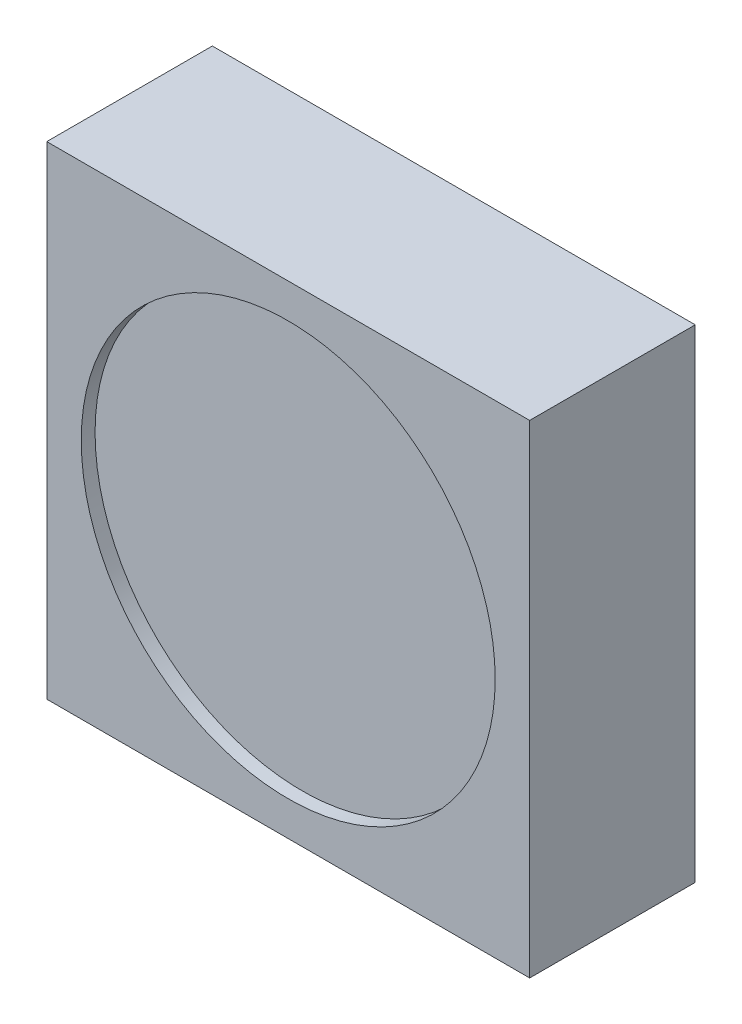
ISO-10303-21;
HEADER;
FILE_DESCRIPTION(('STEP AP214'),'2;1');
FILE_NAME('part.step','',(''),(''),'','','');
FILE_SCHEMA(('AUTOMOTIVE_DESIGN { 1 0 10303 214 1 1 1 1 }'));
ENDSEC;
DATA;
#1=APPLICATION_CONTEXT('core data for automotive mechanical design processes');
#2=APPLICATION_PROTOCOL_DEFINITION('international standard','automotive_design',2000,#1);
#3=PRODUCT_CONTEXT('',#1,'mechanical');
#4=PRODUCT('Part','Part','',(#3));
#5=PRODUCT_RELATED_PRODUCT_CATEGORY('part','',(#4));
#6=PRODUCT_DEFINITION_FORMATION('','',#4);
#7=PRODUCT_DEFINITION_CONTEXT('part definition',#1,'design');
#8=PRODUCT_DEFINITION('design','',#6,#7);
#9=PRODUCT_DEFINITION_SHAPE('','',#8);
#10=(LENGTH_UNIT() NAMED_UNIT(*) SI_UNIT(.MILLI.,.METRE.));
#11=(NAMED_UNIT(*) PLANE_ANGLE_UNIT() SI_UNIT($,.RADIAN.));
#12=(NAMED_UNIT(*) SI_UNIT($,.STERADIAN.) SOLID_ANGLE_UNIT());
#13=UNCERTAINTY_MEASURE_WITH_UNIT(LENGTH_MEASURE(1.E-05),#10,'distance_accuracy_value','');
#14=(GEOMETRIC_REPRESENTATION_CONTEXT(3) GLOBAL_UNCERTAINTY_ASSIGNED_CONTEXT((#13)) GLOBAL_UNIT_ASSIGNED_CONTEXT((#10,
#11,#12)) REPRESENTATION_CONTEXT('',''));
#15=CARTESIAN_POINT('',(0.,0.,0.));
#16=DIRECTION('',(0.,0.,1.));
#17=DIRECTION('',(1.,0.,0.));
#18=AXIS2_PLACEMENT_3D('',#15,#16,#17);
#19=CARTESIAN_POINT('',(0.,0.,0.));
#20=DIRECTION('',(0.,0.,1.));
#21=DIRECTION('',(1.,0.,0.));
#22=AXIS2_PLACEMENT_3D('',#19,#20,#21);
#23=PLANE('',#22);
#24=DIRECTION('',(0.,1.,0.));
#25=VECTOR('',#24,1.);
#26=CARTESIAN_POINT('',(1.75,-1.75,0.));
#27=LINE('',#26,#25);
#28=CARTESIAN_POINT('',(1.75,-1.75,0.));
#29=VERTEX_POINT('',#28);
#30=CARTESIAN_POINT('',(1.75,1.75,0.));
#31=VERTEX_POINT('',#30);
#32=EDGE_CURVE('E29',#29,#31,#27,.T.);
#33=ORIENTED_EDGE('',*,*,#32,.F.);
#34=DIRECTION('',(1.,0.,0.));
#35=VECTOR('',#34,1.);
#36=CARTESIAN_POINT('',(-1.75,-1.75,0.));
#37=LINE('',#36,#35);
#38=CARTESIAN_POINT('',(-1.75,-1.75,0.));
#39=VERTEX_POINT('',#38);
#40=EDGE_CURVE('E91',#39,#29,#37,.T.);
#41=ORIENTED_EDGE('',*,*,#40,.F.);
#42=DIRECTION('',(0.,-1.,0.));
#43=VECTOR('',#42,1.);
#44=CARTESIAN_POINT('',(-1.75,1.75,0.));
#45=LINE('',#44,#43);
#46=CARTESIAN_POINT('',(-1.75,1.75,0.));
#47=VERTEX_POINT('',#46);
#48=EDGE_CURVE('E100',#47,#39,#45,.T.);
#49=ORIENTED_EDGE('',*,*,#48,.F.);
#50=DIRECTION('',(-1.,0.,0.));
#51=VECTOR('',#50,1.);
#52=CARTESIAN_POINT('',(1.75,1.75,0.));
#53=LINE('',#52,#51);
#54=EDGE_CURVE('E109',#31,#47,#53,.T.);
#55=ORIENTED_EDGE('',*,*,#54,.F.);
#56=EDGE_LOOP('',(#33,#41,#49,#55));
#57=FACE_BOUND('',#56,.T.);
#58=ADVANCED_FACE('F18',(#57),#23,.F.);
#59=CARTESIAN_POINT('',(0.,0.,1.2));
#60=DIRECTION('',(0.,0.,1.));
#61=DIRECTION('',(1.,0.,0.));
#62=AXIS2_PLACEMENT_3D('',#59,#60,#61);
#63=PLANE('',#62);
#64=CARTESIAN_POINT('',(0.,0.,1.2));
#65=DIRECTION('',(0.,0.,-1.));
#66=DIRECTION('',(1.,0.,0.));
#67=AXIS2_PLACEMENT_3D('',#64,#65,#66);
#68=CIRCLE('',#67,1.5);
#69=CARTESIAN_POINT('',(-1.5,0.,1.2));
#70=VERTEX_POINT('',#69);
#71=EDGE_CURVE('E103',#70,#70,#68,.T.);
#72=ORIENTED_EDGE('',*,*,#71,.T.);
#73=EDGE_LOOP('',(#72));
#74=FACE_BOUND('',#73,.T.);
#75=DIRECTION('',(0.,1.,0.));
#76=VECTOR('',#75,1.);
#77=CARTESIAN_POINT('',(1.75,-1.75,1.2));
#78=LINE('',#77,#76);
#79=CARTESIAN_POINT('',(1.75,-1.75,1.2));
#80=VERTEX_POINT('',#79);
#81=CARTESIAN_POINT('',(1.75,1.75,1.2));
#82=VERTEX_POINT('',#81);
#83=EDGE_CURVE('E11',#80,#82,#78,.T.);
#84=ORIENTED_EDGE('',*,*,#83,.T.);
#85=DIRECTION('',(-1.,0.,0.));
#86=VECTOR('',#85,1.);
#87=CARTESIAN_POINT('',(1.75,1.75,1.2));
#88=LINE('',#87,#86);
#89=CARTESIAN_POINT('',(-1.75,1.75,1.2));
#90=VERTEX_POINT('',#89);
#91=EDGE_CURVE('E113',#82,#90,#88,.T.);
#92=ORIENTED_EDGE('',*,*,#91,.T.);
#93=DIRECTION('',(0.,-1.,0.));
#94=VECTOR('',#93,1.);
#95=CARTESIAN_POINT('',(-1.75,1.75,1.2));
#96=LINE('',#95,#94);
#97=CARTESIAN_POINT('',(-1.75,-1.75,1.2));
#98=VERTEX_POINT('',#97);
#99=EDGE_CURVE('E82',#90,#98,#96,.T.);
#100=ORIENTED_EDGE('',*,*,#99,.T.);
#101=DIRECTION('',(1.,0.,0.));
#102=VECTOR('',#101,1.);
#103=CARTESIAN_POINT('',(-1.75,-1.75,1.2));
#104=LINE('',#103,#102);
#105=EDGE_CURVE('E79',#98,#80,#104,.T.);
#106=ORIENTED_EDGE('',*,*,#105,.T.);
#107=EDGE_LOOP('',(#84,#92,#100,#106));
#108=FACE_BOUND('',#107,.T.);
#109=ADVANCED_FACE('F80',(#74,#108),#63,.T.);
#110=CARTESIAN_POINT('',(1.75,-1.75,0.));
#111=DIRECTION('',(1.,0.,0.));
#112=DIRECTION('',(0.,1.,0.));
#113=AXIS2_PLACEMENT_3D('',#110,#111,#112);
#114=PLANE('',#113);
#115=ORIENTED_EDGE('',*,*,#32,.T.);
#116=DIRECTION('',(0.,0.,1.));
#117=VECTOR('',#116,1.);
#118=CARTESIAN_POINT('',(1.75,1.75,0.));
#119=LINE('',#118,#117);
#120=EDGE_CURVE('E76',#31,#82,#119,.T.);
#121=ORIENTED_EDGE('',*,*,#120,.T.);
#122=ORIENTED_EDGE('',*,*,#83,.F.);
#123=DIRECTION('',(0.,0.,1.));
#124=VECTOR('',#123,1.);
#125=CARTESIAN_POINT('',(1.75,-1.75,0.));
#126=LINE('',#125,#124);
#127=EDGE_CURVE('E73',#29,#80,#126,.T.);
#128=ORIENTED_EDGE('',*,*,#127,.F.);
#129=EDGE_LOOP('',(#115,#121,#122,#128));
#130=FACE_BOUND('',#129,.T.);
#131=ADVANCED_FACE('F71',(#130),#114,.T.);
#132=CARTESIAN_POINT('',(1.75,1.75,0.));
#133=DIRECTION('',(0.,1.,0.));
#134=DIRECTION('',(1.,0.,0.));
#135=AXIS2_PLACEMENT_3D('',#132,#133,#134);
#136=PLANE('',#135);
#137=ORIENTED_EDGE('',*,*,#54,.T.);
#138=DIRECTION('',(0.,0.,1.));
#139=VECTOR('',#138,1.);
#140=CARTESIAN_POINT('',(-1.75,1.75,0.));
#141=LINE('',#140,#139);
#142=EDGE_CURVE('E114',#47,#90,#141,.T.);
#143=ORIENTED_EDGE('',*,*,#142,.T.);
#144=ORIENTED_EDGE('',*,*,#91,.F.);
#145=ORIENTED_EDGE('',*,*,#120,.F.);
#146=EDGE_LOOP('',(#137,#143,#144,#145));
#147=FACE_BOUND('',#146,.T.);
#148=ADVANCED_FACE('F20',(#147),#136,.T.);
#149=CARTESIAN_POINT('',(-1.75,1.75,0.));
#150=DIRECTION('',(-1.,0.,0.));
#151=DIRECTION('',(0.,0.,1.));
#152=AXIS2_PLACEMENT_3D('',#149,#150,#151);
#153=PLANE('',#152);
#154=ORIENTED_EDGE('',*,*,#48,.T.);
#155=DIRECTION('',(0.,0.,1.));
#156=VECTOR('',#155,1.);
#157=CARTESIAN_POINT('',(-1.75,-1.75,0.));
#158=LINE('',#157,#156);
#159=EDGE_CURVE('E87',#39,#98,#158,.T.);
#160=ORIENTED_EDGE('',*,*,#159,.T.);
#161=ORIENTED_EDGE('',*,*,#99,.F.);
#162=ORIENTED_EDGE('',*,*,#142,.F.);
#163=EDGE_LOOP('',(#154,#160,#161,#162));
#164=FACE_BOUND('',#163,.T.);
#165=ADVANCED_FACE('F129',(#164),#153,.T.);
#166=CARTESIAN_POINT('',(-1.75,-1.75,0.));
#167=DIRECTION('',(0.,-1.,0.));
#168=DIRECTION('',(0.,0.,-1.));
#169=AXIS2_PLACEMENT_3D('',#166,#167,#168);
#170=PLANE('',#169);
#171=ORIENTED_EDGE('',*,*,#40,.T.);
#172=ORIENTED_EDGE('',*,*,#127,.T.);
#173=ORIENTED_EDGE('',*,*,#105,.F.);
#174=ORIENTED_EDGE('',*,*,#159,.F.);
#175=EDGE_LOOP('',(#171,#172,#173,#174));
#176=FACE_BOUND('',#175,.T.);
#177=ADVANCED_FACE('F89',(#176),#170,.T.);
#178=CARTESIAN_POINT('',(0.,0.,1.1));
#179=DIRECTION('',(0.,0.,1.));
#180=DIRECTION('',(1.,0.,0.));
#181=AXIS2_PLACEMENT_3D('',#178,#179,#180);
#182=PLANE('',#181);
#183=CARTESIAN_POINT('',(0.,0.,1.1));
#184=DIRECTION('',(0.,0.,-1.));
#185=DIRECTION('',(1.,0.,0.));
#186=AXIS2_PLACEMENT_3D('',#183,#184,#185);
#187=CIRCLE('',#186,1.5);
#188=CARTESIAN_POINT('',(-1.5,0.,1.1));
#189=VERTEX_POINT('',#188);
#190=EDGE_CURVE('E97',#189,#189,#187,.T.);
#191=ORIENTED_EDGE('',*,*,#190,.F.);
#192=EDGE_LOOP('',(#191));
#193=FACE_BOUND('',#192,.T.);
#194=ADVANCED_FACE('F202',(#193),#182,.T.);
#195=CARTESIAN_POINT('',(0.,0.,1.2));
#196=DIRECTION('',(0.,0.,-1.));
#197=DIRECTION('',(1.,0.,0.));
#198=AXIS2_PLACEMENT_3D('',#195,#196,#197);
#199=CYLINDRICAL_SURFACE('',#198,1.5);
#200=ORIENTED_EDGE('',*,*,#71,.F.);
#201=DIRECTION('',(0.,0.,-1.));
#202=VECTOR('',#201,1.);
#203=CARTESIAN_POINT('',(-1.5,0.,1.2));
#204=LINE('',#203,#202);
#205=EDGE_CURVE('E22',#70,#189,#204,.T.);
#206=ORIENTED_EDGE('',*,*,#205,.T.);
#207=ORIENTED_EDGE('',*,*,#190,.T.);
#208=ORIENTED_EDGE('',*,*,#205,.F.);
#209=EDGE_LOOP('',(#200,#206,#207,#208));
#210=FACE_BOUND('',#209,.T.);
#211=ADVANCED_FACE('F207',(#210),#199,.F.);
#212=CLOSED_SHELL('',(#58,#109,#131,#148,#165,#177,#194,#211));
#213=MANIFOLD_SOLID_BREP('B1',#212);
#214=ADVANCED_BREP_SHAPE_REPRESENTATION('',(#18,#213),#14);
#215=SHAPE_DEFINITION_REPRESENTATION(#9,#214);
ENDSEC;
END-ISO-10303-21;
